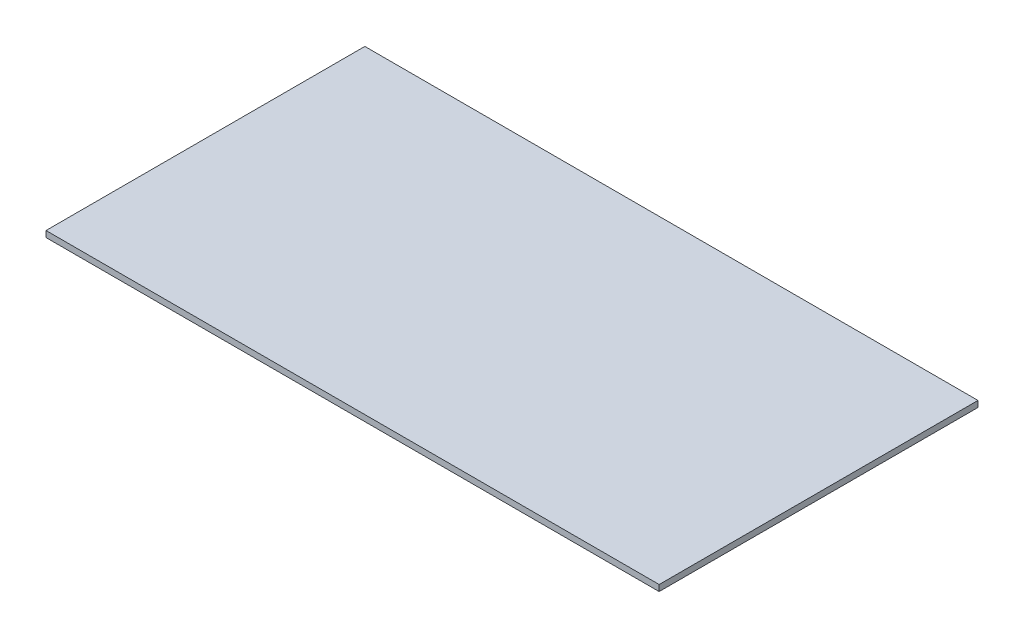
ISO-10303-21;
HEADER;
FILE_DESCRIPTION(('STEP AP214'),'2;1');
FILE_NAME('part.step','',(''),(''),'','','');
FILE_SCHEMA(('AUTOMOTIVE_DESIGN { 1 0 10303 214 1 1 1 1 }'));
ENDSEC;
DATA;
#1=APPLICATION_CONTEXT('core data for automotive mechanical design processes');
#2=APPLICATION_PROTOCOL_DEFINITION('international standard','automotive_design',2000,#1);
#3=PRODUCT_CONTEXT('',#1,'mechanical');
#4=PRODUCT('Part','Part','',(#3));
#5=PRODUCT_RELATED_PRODUCT_CATEGORY('part','',(#4));
#6=PRODUCT_DEFINITION_FORMATION('','',#4);
#7=PRODUCT_DEFINITION_CONTEXT('part definition',#1,'design');
#8=PRODUCT_DEFINITION('design','',#6,#7);
#9=PRODUCT_DEFINITION_SHAPE('','',#8);
#10=(LENGTH_UNIT() NAMED_UNIT(*) SI_UNIT(.MILLI.,.METRE.));
#11=(NAMED_UNIT(*) PLANE_ANGLE_UNIT() SI_UNIT($,.RADIAN.));
#12=(NAMED_UNIT(*) SI_UNIT($,.STERADIAN.) SOLID_ANGLE_UNIT());
#13=UNCERTAINTY_MEASURE_WITH_UNIT(LENGTH_MEASURE(1.E-05),#10,'distance_accuracy_value','');
#14=(GEOMETRIC_REPRESENTATION_CONTEXT(3) GLOBAL_UNCERTAINTY_ASSIGNED_CONTEXT((#13)) GLOBAL_UNIT_ASSIGNED_CONTEXT((#10,
#11,#12)) REPRESENTATION_CONTEXT('',''));
#15=CARTESIAN_POINT('',(0.,0.,0.));
#16=DIRECTION('',(0.,0.,1.));
#17=DIRECTION('',(1.,0.,0.));
#18=AXIS2_PLACEMENT_3D('',#15,#16,#17);
#19=CARTESIAN_POINT('',(250.,5.,-130.));
#20=DIRECTION('',(-1.,0.,0.));
#21=DIRECTION('',(0.,0.,1.));
#22=AXIS2_PLACEMENT_3D('',#19,#20,#21);
#23=PLANE('',#22);
#24=DIRECTION('',(0.,0.,-1.));
#25=VECTOR('',#24,1.);
#26=CARTESIAN_POINT('',(250.,0.,-130.));
#27=LINE('',#26,#25);
#28=CARTESIAN_POINT('',(250.,0.,130.));
#29=VERTEX_POINT('',#28);
#30=CARTESIAN_POINT('',(250.,0.,-130.));
#31=VERTEX_POINT('',#30);
#32=EDGE_CURVE('E107',#29,#31,#27,.T.);
#33=ORIENTED_EDGE('',*,*,#32,.T.);
#34=DIRECTION('',(0.,-1.,0.));
#35=VECTOR('',#34,1.);
#36=CARTESIAN_POINT('',(250.,5.,-130.));
#37=LINE('',#36,#35);
#38=CARTESIAN_POINT('',(250.,5.,-130.));
#39=VERTEX_POINT('',#38);
#40=EDGE_CURVE('E11',#39,#31,#37,.T.);
#41=ORIENTED_EDGE('',*,*,#40,.F.);
#42=DIRECTION('',(0.,0.,-1.));
#43=VECTOR('',#42,1.);
#44=CARTESIAN_POINT('',(250.,5.,-130.));
#45=LINE('',#44,#43);
#46=CARTESIAN_POINT('',(250.,5.,130.));
#47=VERTEX_POINT('',#46);
#48=EDGE_CURVE('E91',#47,#39,#45,.T.);
#49=ORIENTED_EDGE('',*,*,#48,.F.);
#50=DIRECTION('',(0.,-1.,0.));
#51=VECTOR('',#50,1.);
#52=CARTESIAN_POINT('',(250.,5.,130.));
#53=LINE('',#52,#51);
#54=EDGE_CURVE('E103',#47,#29,#53,.T.);
#55=ORIENTED_EDGE('',*,*,#54,.T.);
#56=EDGE_LOOP('',(#33,#41,#49,#55));
#57=FACE_BOUND('',#56,.T.);
#58=ADVANCED_FACE('F39',(#57),#23,.F.);
#59=CARTESIAN_POINT('',(-250.,5.,-130.));
#60=DIRECTION('',(0.,0.,1.));
#61=DIRECTION('',(1.,0.,0.));
#62=AXIS2_PLACEMENT_3D('',#59,#60,#61);
#63=PLANE('',#62);
#64=DIRECTION('',(-1.,0.,0.));
#65=VECTOR('',#64,1.);
#66=CARTESIAN_POINT('',(-250.,0.,-130.));
#67=LINE('',#66,#65);
#68=CARTESIAN_POINT('',(-250.,0.,-130.));
#69=VERTEX_POINT('',#68);
#70=EDGE_CURVE('E96',#31,#69,#67,.T.);
#71=ORIENTED_EDGE('',*,*,#70,.T.);
#72=DIRECTION('',(0.,-1.,0.));
#73=VECTOR('',#72,1.);
#74=CARTESIAN_POINT('',(-250.,5.,-130.));
#75=LINE('',#74,#73);
#76=CARTESIAN_POINT('',(-250.,5.,-130.));
#77=VERTEX_POINT('',#76);
#78=EDGE_CURVE('E48',#77,#69,#75,.T.);
#79=ORIENTED_EDGE('',*,*,#78,.F.);
#80=DIRECTION('',(-1.,0.,0.));
#81=VECTOR('',#80,1.);
#82=CARTESIAN_POINT('',(-250.,5.,-130.));
#83=LINE('',#82,#81);
#84=EDGE_CURVE('E86',#39,#77,#83,.T.);
#85=ORIENTED_EDGE('',*,*,#84,.F.);
#86=ORIENTED_EDGE('',*,*,#40,.T.);
#87=EDGE_LOOP('',(#71,#79,#85,#86));
#88=FACE_BOUND('',#87,.T.);
#89=ADVANCED_FACE('F95',(#88),#63,.F.);
#90=CARTESIAN_POINT('',(-250.,5.,-130.));
#91=DIRECTION('',(1.,0.,0.));
#92=DIRECTION('',(0.,0.,-1.));
#93=AXIS2_PLACEMENT_3D('',#90,#91,#92);
#94=PLANE('',#93);
#95=DIRECTION('',(0.,0.,1.));
#96=VECTOR('',#95,1.);
#97=CARTESIAN_POINT('',(-250.,0.,-130.));
#98=LINE('',#97,#96);
#99=CARTESIAN_POINT('',(-250.,0.,130.));
#100=VERTEX_POINT('',#99);
#101=EDGE_CURVE('E73',#69,#100,#98,.T.);
#102=ORIENTED_EDGE('',*,*,#101,.T.);
#103=DIRECTION('',(0.,-1.,0.));
#104=VECTOR('',#103,1.);
#105=CARTESIAN_POINT('',(-250.,5.,130.));
#106=LINE('',#105,#104);
#107=CARTESIAN_POINT('',(-250.,5.,130.));
#108=VERTEX_POINT('',#107);
#109=EDGE_CURVE('E98',#108,#100,#106,.T.);
#110=ORIENTED_EDGE('',*,*,#109,.F.);
#111=DIRECTION('',(0.,0.,1.));
#112=VECTOR('',#111,1.);
#113=CARTESIAN_POINT('',(-250.,5.,-130.));
#114=LINE('',#113,#112);
#115=EDGE_CURVE('E89',#77,#108,#114,.T.);
#116=ORIENTED_EDGE('',*,*,#115,.F.);
#117=ORIENTED_EDGE('',*,*,#78,.T.);
#118=EDGE_LOOP('',(#102,#110,#116,#117));
#119=FACE_BOUND('',#118,.T.);
#120=ADVANCED_FACE('F99',(#119),#94,.F.);
#121=CARTESIAN_POINT('',(-250.,5.,130.));
#122=DIRECTION('',(0.,0.,-1.));
#123=DIRECTION('',(-1.,0.,0.));
#124=AXIS2_PLACEMENT_3D('',#121,#122,#123);
#125=PLANE('',#124);
#126=DIRECTION('',(1.,0.,0.));
#127=VECTOR('',#126,1.);
#128=CARTESIAN_POINT('',(-250.,0.,130.));
#129=LINE('',#128,#127);
#130=EDGE_CURVE('E79',#100,#29,#129,.T.);
#131=ORIENTED_EDGE('',*,*,#130,.T.);
#132=ORIENTED_EDGE('',*,*,#54,.F.);
#133=DIRECTION('',(1.,0.,0.));
#134=VECTOR('',#133,1.);
#135=CARTESIAN_POINT('',(-250.,5.,130.));
#136=LINE('',#135,#134);
#137=EDGE_CURVE('E56',#108,#47,#136,.T.);
#138=ORIENTED_EDGE('',*,*,#137,.F.);
#139=ORIENTED_EDGE('',*,*,#109,.T.);
#140=EDGE_LOOP('',(#131,#132,#138,#139));
#141=FACE_BOUND('',#140,.T.);
#142=ADVANCED_FACE('F120',(#141),#125,.F.);
#143=CARTESIAN_POINT('',(0.,5.,0.));
#144=DIRECTION('',(0.,1.,0.));
#145=DIRECTION('',(0.,0.,1.));
#146=AXIS2_PLACEMENT_3D('',#143,#144,#145);
#147=PLANE('',#146);
#148=ORIENTED_EDGE('',*,*,#48,.T.);
#149=ORIENTED_EDGE('',*,*,#84,.T.);
#150=ORIENTED_EDGE('',*,*,#115,.T.);
#151=ORIENTED_EDGE('',*,*,#137,.T.);
#152=EDGE_LOOP('',(#148,#149,#150,#151));
#153=FACE_BOUND('',#152,.T.);
#154=ADVANCED_FACE('F87',(#153),#147,.T.);
#155=CARTESIAN_POINT('',(0.,0.,0.));
#156=DIRECTION('',(0.,1.,0.));
#157=DIRECTION('',(0.,0.,1.));
#158=AXIS2_PLACEMENT_3D('',#155,#156,#157);
#159=PLANE('',#158);
#160=ORIENTED_EDGE('',*,*,#32,.F.);
#161=ORIENTED_EDGE('',*,*,#130,.F.);
#162=ORIENTED_EDGE('',*,*,#101,.F.);
#163=ORIENTED_EDGE('',*,*,#70,.F.);
#164=EDGE_LOOP('',(#160,#161,#162,#163));
#165=FACE_BOUND('',#164,.T.);
#166=ADVANCED_FACE('F123',(#165),#159,.F.);
#167=CLOSED_SHELL('',(#58,#89,#120,#142,#154,#166));
#168=MANIFOLD_SOLID_BREP('B2',#167);
#169=ADVANCED_BREP_SHAPE_REPRESENTATION('',(#18,#168),#14);
#170=SHAPE_DEFINITION_REPRESENTATION(#9,#169);
ENDSEC;
END-ISO-10303-21;
